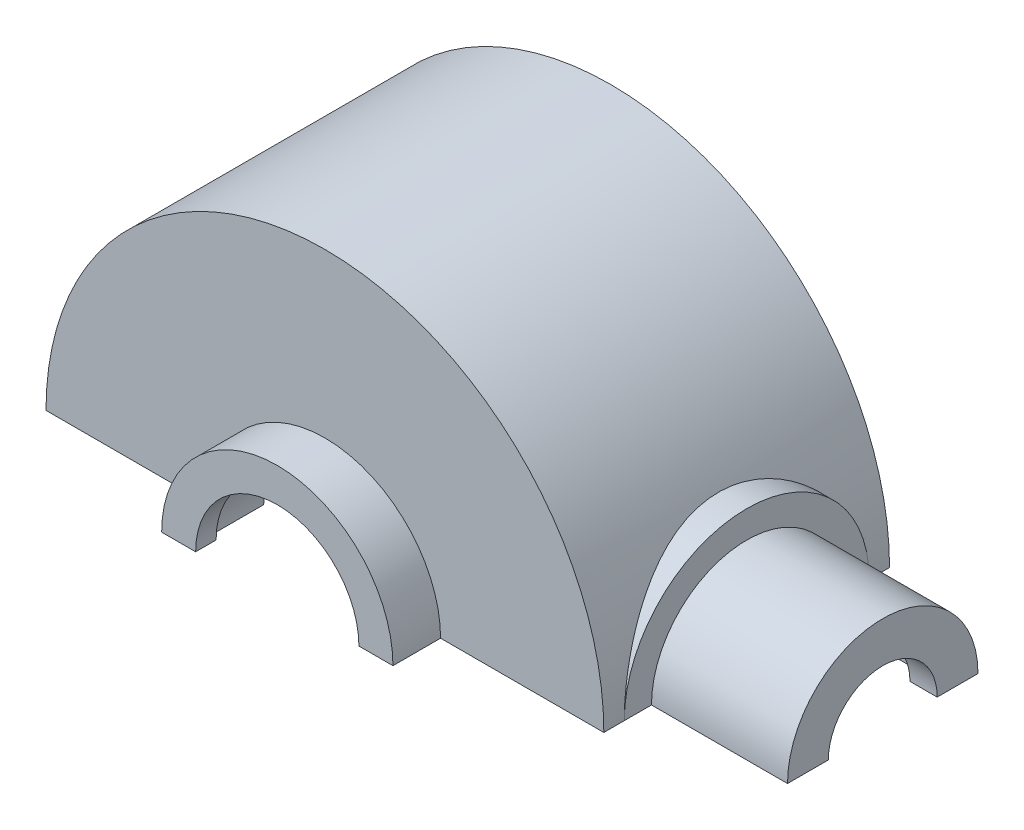
ISO-10303-21;
HEADER;
FILE_DESCRIPTION(('STEP AP214'),'2;1');
FILE_NAME('part.step','',(''),(''),'','','');
FILE_SCHEMA(('AUTOMOTIVE_DESIGN { 1 0 10303 214 1 1 1 1 }'));
ENDSEC;
DATA;
#1=APPLICATION_CONTEXT('core data for automotive mechanical design processes');
#2=APPLICATION_PROTOCOL_DEFINITION('international standard','automotive_design',2000,#1);
#3=PRODUCT_CONTEXT('',#1,'mechanical');
#4=PRODUCT('Part','Part','',(#3));
#5=PRODUCT_RELATED_PRODUCT_CATEGORY('part','',(#4));
#6=PRODUCT_DEFINITION_FORMATION('','',#4);
#7=PRODUCT_DEFINITION_CONTEXT('part definition',#1,'design');
#8=PRODUCT_DEFINITION('design','',#6,#7);
#9=PRODUCT_DEFINITION_SHAPE('','',#8);
#10=(LENGTH_UNIT() NAMED_UNIT(*) SI_UNIT(.MILLI.,.METRE.));
#11=(NAMED_UNIT(*) PLANE_ANGLE_UNIT() SI_UNIT($,.RADIAN.));
#12=(NAMED_UNIT(*) SI_UNIT($,.STERADIAN.) SOLID_ANGLE_UNIT());
#13=UNCERTAINTY_MEASURE_WITH_UNIT(LENGTH_MEASURE(1.E-05),#10,'distance_accuracy_value','');
#14=(GEOMETRIC_REPRESENTATION_CONTEXT(3) GLOBAL_UNCERTAINTY_ASSIGNED_CONTEXT((#13)) GLOBAL_UNIT_ASSIGNED_CONTEXT((#10,
#11,#12)) REPRESENTATION_CONTEXT('',''));
#15=CARTESIAN_POINT('',(0.,0.,0.));
#16=DIRECTION('',(0.,0.,1.));
#17=DIRECTION('',(1.,0.,0.));
#18=AXIS2_PLACEMENT_3D('',#15,#16,#17);
#19=CARTESIAN_POINT('',(0.,0.,0.));
#20=DIRECTION('',(0.,-1.,0.));
#21=DIRECTION('',(0.,0.,1.));
#22=AXIS2_PLACEMENT_3D('',#19,#20,#21);
#23=PLANE('',#22);
#24=DIRECTION('',(0.,0.,1.));
#25=VECTOR('',#24,1.);
#26=CARTESIAN_POINT('',(6.5,0.,-12.));
#27=LINE('',#26,#25);
#28=CARTESIAN_POINT('',(6.5,0.,-12.5));
#29=VERTEX_POINT('',#28);
#30=CARTESIAN_POINT('',(6.5,0.,-8.5));
#31=VERTEX_POINT('',#30);
#32=EDGE_CURVE('E340',#29,#31,#27,.T.);
#33=ORIENTED_EDGE('',*,*,#32,.F.);
#34=DIRECTION('',(-1.,0.,0.));
#35=VECTOR('',#34,1.);
#36=CARTESIAN_POINT('',(0.,0.,-12.5));
#37=LINE('',#36,#35);
#38=CARTESIAN_POINT('',(6.,0.,-12.5));
#39=VERTEX_POINT('',#38);
#40=EDGE_CURVE('E240',#29,#39,#37,.T.);
#41=ORIENTED_EDGE('',*,*,#40,.T.);
#42=DIRECTION('',(0.,0.,1.));
#43=VECTOR('',#42,1.);
#44=CARTESIAN_POINT('',(6.,0.,-14.));
#45=LINE('',#44,#43);
#46=CARTESIAN_POINT('',(6.,0.,-14.));
#47=VERTEX_POINT('',#46);
#48=EDGE_CURVE('E423',#47,#39,#45,.T.);
#49=ORIENTED_EDGE('',*,*,#48,.F.);
#50=DIRECTION('',(1.,0.,0.));
#51=VECTOR('',#50,1.);
#52=CARTESIAN_POINT('',(0.,0.,-14.));
#53=LINE('',#52,#51);
#54=CARTESIAN_POINT('',(8.5,0.,-14.));
#55=VERTEX_POINT('',#54);
#56=EDGE_CURVE('E382',#47,#55,#53,.T.);
#57=ORIENTED_EDGE('',*,*,#56,.T.);
#58=DIRECTION('',(0.,0.,1.));
#59=VECTOR('',#58,1.);
#60=CARTESIAN_POINT('',(8.5,0.,-14.));
#61=LINE('',#60,#59);
#62=CARTESIAN_POINT('',(8.5,0.,-10.5));
#63=VERTEX_POINT('',#62);
#64=EDGE_CURVE('E386',#55,#63,#61,.T.);
#65=ORIENTED_EDGE('',*,*,#64,.T.);
#66=DIRECTION('',(1.,0.,0.));
#67=VECTOR('',#66,1.);
#68=CARTESIAN_POINT('',(8.5,0.,-10.5));
#69=LINE('',#68,#67);
#70=CARTESIAN_POINT('',(20.5,-1.43150734892568E-13,-10.5));
#71=VERTEX_POINT('',#70);
#72=EDGE_CURVE('E389',#63,#71,#69,.T.);
#73=ORIENTED_EDGE('',*,*,#72,.T.);
#74=DIRECTION('',(0.,0.,1.));
#75=VECTOR('',#74,1.);
#76=CARTESIAN_POINT('',(20.5,-1.43150734892568E-13,-10.5));
#77=LINE('',#76,#75);
#78=CARTESIAN_POINT('',(20.5,0.,-9.));
#79=VERTEX_POINT('',#78);
#80=EDGE_CURVE('E393',#71,#79,#77,.T.);
#81=ORIENTED_EDGE('',*,*,#80,.T.);
#82=DIRECTION('',(0.,0.,-1.));
#83=VECTOR('',#82,1.);
#84=CARTESIAN_POINT('',(20.5,0.,0.));
#85=LINE('',#84,#83);
#86=CARTESIAN_POINT('',(20.5,0.,-7.));
#87=VERTEX_POINT('',#86);
#88=EDGE_CURVE('E446',#87,#79,#85,.T.);
#89=ORIENTED_EDGE('',*,*,#88,.F.);
#90=DIRECTION('',(-1.,0.,0.));
#91=VECTOR('',#90,1.);
#92=CARTESIAN_POINT('',(30.5,0.,-7.));
#93=LINE('',#92,#91);
#94=CARTESIAN_POINT('',(30.5,0.,-7.));
#95=VERTEX_POINT('',#94);
#96=EDGE_CURVE('E507',#95,#87,#93,.T.);
#97=ORIENTED_EDGE('',*,*,#96,.F.);
#98=DIRECTION('',(0.,0.,-1.));
#99=VECTOR('',#98,1.);
#100=CARTESIAN_POINT('',(30.5,0.,7.));
#101=LINE('',#100,#99);
#102=CARTESIAN_POINT('',(30.5,0.,-4.));
#103=VERTEX_POINT('',#102);
#104=EDGE_CURVE('E503',#103,#95,#101,.T.);
#105=ORIENTED_EDGE('',*,*,#104,.F.);
#106=DIRECTION('',(-1.,0.,0.));
#107=VECTOR('',#106,1.);
#108=CARTESIAN_POINT('',(30.5,-2.12980361669431E-13,-4.));
#109=LINE('',#108,#107);
#110=CARTESIAN_POINT('',(28.5,0.,-4.));
#111=VERTEX_POINT('',#110);
#112=EDGE_CURVE('E270',#103,#111,#109,.T.);
#113=ORIENTED_EDGE('',*,*,#112,.T.);
#114=DIRECTION('',(0.,0.,-1.));
#115=VECTOR('',#114,1.);
#116=CARTESIAN_POINT('',(28.5,0.,0.));
#117=LINE('',#116,#115);
#118=CARTESIAN_POINT('',(28.5,-1.99014436314059E-13,-5.));
#119=VERTEX_POINT('',#118);
#120=EDGE_CURVE('E550',#111,#119,#117,.T.);
#121=ORIENTED_EDGE('',*,*,#120,.T.);
#122=DIRECTION('',(-1.,0.,0.));
#123=VECTOR('',#122,1.);
#124=CARTESIAN_POINT('',(28.5,-1.99014436314059E-13,-5.));
#125=LINE('',#124,#123);
#126=CARTESIAN_POINT('',(24.5,-1.99014436314059E-13,-5.));
#127=VERTEX_POINT('',#126);
#128=EDGE_CURVE('E486',#119,#127,#125,.T.);
#129=ORIENTED_EDGE('',*,*,#128,.T.);
#130=DIRECTION('',(0.,0.,-1.));
#131=VECTOR('',#130,1.);
#132=CARTESIAN_POINT('',(24.5,-1.99014436314059E-13,5.));
#133=LINE('',#132,#131);
#134=CARTESIAN_POINT('',(24.5,-1.99014436314059E-13,-2.5));
#135=VERTEX_POINT('',#134);
#136=EDGE_CURVE('E266',#135,#127,#133,.T.);
#137=ORIENTED_EDGE('',*,*,#136,.F.);
#138=DIRECTION('',(1.,0.,0.));
#139=VECTOR('',#138,1.);
#140=CARTESIAN_POINT('',(23.5,-1.64099622925627E-13,-2.5));
#141=LINE('',#140,#139);
#142=CARTESIAN_POINT('',(23.5,-1.99014436314059E-13,-2.5));
#143=VERTEX_POINT('',#142);
#144=EDGE_CURVE('E253',#143,#135,#141,.T.);
#145=ORIENTED_EDGE('',*,*,#144,.F.);
#146=DIRECTION('',(0.,0.,-1.));
#147=VECTOR('',#146,1.);
#148=CARTESIAN_POINT('',(23.5,-1.99014436314059E-13,5.));
#149=LINE('',#148,#147);
#150=CARTESIAN_POINT('',(23.5,-1.99014436314059E-13,-5.));
#151=VERTEX_POINT('',#150);
#152=EDGE_CURVE('E258',#143,#151,#149,.T.);
#153=ORIENTED_EDGE('',*,*,#152,.T.);
#154=CARTESIAN_POINT('',(18.5,-1.29184809537196E-13,-5.));
#155=VERTEX_POINT('',#154);
#156=EDGE_CURVE('E481',#151,#155,#125,.T.);
#157=ORIENTED_EDGE('',*,*,#156,.T.);
#158=DIRECTION('',(0.,0.,1.));
#159=VECTOR('',#158,1.);
#160=CARTESIAN_POINT('',(18.5,-1.29184809537196E-13,-8.5));
#161=LINE('',#160,#159);
#162=CARTESIAN_POINT('',(18.5,-1.29184809537196E-13,-8.5));
#163=VERTEX_POINT('',#162);
#164=EDGE_CURVE('E361',#163,#155,#161,.T.);
#165=ORIENTED_EDGE('',*,*,#164,.F.);
#166=DIRECTION('',(1.,0.,0.));
#167=VECTOR('',#166,1.);
#168=CARTESIAN_POINT('',(8.5,0.,-8.5));
#169=LINE('',#168,#167);
#170=EDGE_CURVE('E343',#31,#163,#169,.T.);
#171=ORIENTED_EDGE('',*,*,#170,.F.);
#172=EDGE_LOOP('',(#33,#41,#49,#57,#65,#73,#81,#89,#97,#105,#113,#121,#129,#137,#145,#153,#157,
#165,#171));
#173=FACE_BOUND('',#172,.T.);
#174=ADVANCED_FACE('F39',(#173),#23,.T.);
#175=DIRECTION('',(-1.,0.,0.));
#176=VECTOR('',#175,1.);
#177=CARTESIAN_POINT('',(0.,0.,12.5));
#178=LINE('',#177,#176);
#179=CARTESIAN_POINT('',(6.5,0.,12.5));
#180=VERTEX_POINT('',#179);
#181=CARTESIAN_POINT('',(6.,0.,12.5));
#182=VERTEX_POINT('',#181);
#183=EDGE_CURVE('E61',#180,#182,#178,.T.);
#184=ORIENTED_EDGE('',*,*,#183,.F.);
#185=DIRECTION('',(0.,0.,1.));
#186=VECTOR('',#185,1.);
#187=CARTESIAN_POINT('',(6.5,0.,8.5));
#188=LINE('',#187,#186);
#189=CARTESIAN_POINT('',(6.5,0.,8.5));
#190=VERTEX_POINT('',#189);
#191=EDGE_CURVE('E220',#190,#180,#188,.T.);
#192=ORIENTED_EDGE('',*,*,#191,.F.);
#193=DIRECTION('',(-1.,0.,0.));
#194=VECTOR('',#193,1.);
#195=CARTESIAN_POINT('',(20.5,-1.43150734892568E-13,8.5));
#196=LINE('',#195,#194);
#197=CARTESIAN_POINT('',(18.5,-1.29184809537196E-13,8.5));
#198=VERTEX_POINT('',#197);
#199=EDGE_CURVE('E227',#198,#190,#196,.T.);
#200=ORIENTED_EDGE('',*,*,#199,.F.);
#201=CARTESIAN_POINT('',(18.5,-1.29184809537196E-13,5.));
#202=VERTEX_POINT('',#201);
#203=EDGE_CURVE('E360',#202,#198,#161,.T.);
#204=ORIENTED_EDGE('',*,*,#203,.F.);
#205=DIRECTION('',(-1.,0.,0.));
#206=VECTOR('',#205,1.);
#207=CARTESIAN_POINT('',(28.5,-1.99014436314059E-13,5.));
#208=LINE('',#207,#206);
#209=CARTESIAN_POINT('',(23.5,-1.99014436314059E-13,5.));
#210=VERTEX_POINT('',#209);
#211=EDGE_CURVE('E493',#210,#202,#208,.T.);
#212=ORIENTED_EDGE('',*,*,#211,.F.);
#213=CARTESIAN_POINT('',(23.5,-1.99014436314059E-13,2.5));
#214=VERTEX_POINT('',#213);
#215=EDGE_CURVE('E260',#210,#214,#149,.T.);
#216=ORIENTED_EDGE('',*,*,#215,.T.);
#217=DIRECTION('',(1.,0.,0.));
#218=VECTOR('',#217,1.);
#219=CARTESIAN_POINT('',(23.5,-1.64099622925627E-13,2.5));
#220=LINE('',#219,#218);
#221=CARTESIAN_POINT('',(24.5,-1.99014436314059E-13,2.5));
#222=VERTEX_POINT('',#221);
#223=EDGE_CURVE('E250',#222,#214,#220,.F.);
#224=ORIENTED_EDGE('',*,*,#223,.F.);
#225=CARTESIAN_POINT('',(24.5,-1.99014436314059E-13,5.));
#226=VERTEX_POINT('',#225);
#227=EDGE_CURVE('E259',#226,#222,#133,.T.);
#228=ORIENTED_EDGE('',*,*,#227,.F.);
#229=CARTESIAN_POINT('',(28.5,-1.99014436314059E-13,5.));
#230=VERTEX_POINT('',#229);
#231=EDGE_CURVE('E494',#230,#226,#208,.T.);
#232=ORIENTED_EDGE('',*,*,#231,.F.);
#233=CARTESIAN_POINT('',(28.5,0.,4.));
#234=VERTEX_POINT('',#233);
#235=EDGE_CURVE('E487',#230,#234,#117,.T.);
#236=ORIENTED_EDGE('',*,*,#235,.T.);
#237=DIRECTION('',(-1.,0.,0.));
#238=VECTOR('',#237,1.);
#239=CARTESIAN_POINT('',(30.5,-2.12980361669431E-13,4.));
#240=LINE('',#239,#238);
#241=CARTESIAN_POINT('',(30.5,0.,4.));
#242=VERTEX_POINT('',#241);
#243=EDGE_CURVE('E273',#234,#242,#240,.F.);
#244=ORIENTED_EDGE('',*,*,#243,.T.);
#245=CARTESIAN_POINT('',(30.5,0.,7.));
#246=VERTEX_POINT('',#245);
#247=EDGE_CURVE('E504',#246,#242,#101,.T.);
#248=ORIENTED_EDGE('',*,*,#247,.F.);
#249=DIRECTION('',(-1.,0.,0.));
#250=VECTOR('',#249,1.);
#251=CARTESIAN_POINT('',(30.5,0.,7.));
#252=LINE('',#251,#250);
#253=CARTESIAN_POINT('',(20.5,0.,7.));
#254=VERTEX_POINT('',#253);
#255=EDGE_CURVE('E447',#246,#254,#252,.T.);
#256=ORIENTED_EDGE('',*,*,#255,.T.);
#257=CARTESIAN_POINT('',(20.5,-1.43150734892568E-13,9.));
#258=VERTEX_POINT('',#257);
#259=EDGE_CURVE('E448',#258,#254,#85,.T.);
#260=ORIENTED_EDGE('',*,*,#259,.F.);
#261=CARTESIAN_POINT('',(20.5,-1.43150734892568E-13,10.5));
#262=VERTEX_POINT('',#261);
#263=EDGE_CURVE('E392',#258,#262,#77,.T.);
#264=ORIENTED_EDGE('',*,*,#263,.T.);
#265=DIRECTION('',(-1.,0.,0.));
#266=VECTOR('',#265,1.);
#267=CARTESIAN_POINT('',(20.5,-1.43150734892568E-13,10.5));
#268=LINE('',#267,#266);
#269=CARTESIAN_POINT('',(8.5,0.,10.5));
#270=VERTEX_POINT('',#269);
#271=EDGE_CURVE('E396',#262,#270,#268,.T.);
#272=ORIENTED_EDGE('',*,*,#271,.T.);
#273=DIRECTION('',(0.,0.,1.));
#274=VECTOR('',#273,1.);
#275=CARTESIAN_POINT('',(8.5,0.,10.5));
#276=LINE('',#275,#274);
#277=CARTESIAN_POINT('',(8.5,0.,14.));
#278=VERTEX_POINT('',#277);
#279=EDGE_CURVE('E399',#270,#278,#276,.T.);
#280=ORIENTED_EDGE('',*,*,#279,.T.);
#281=DIRECTION('',(-1.,0.,0.));
#282=VECTOR('',#281,1.);
#283=CARTESIAN_POINT('',(8.5,0.,14.));
#284=LINE('',#283,#282);
#285=CARTESIAN_POINT('',(6.,0.,14.));
#286=VERTEX_POINT('',#285);
#287=EDGE_CURVE('E380',#278,#286,#284,.T.);
#288=ORIENTED_EDGE('',*,*,#287,.T.);
#289=EDGE_CURVE('E238',#182,#286,#45,.T.);
#290=ORIENTED_EDGE('',*,*,#289,.F.);
#291=EDGE_LOOP('',(#184,#192,#200,#204,#212,#216,#224,#228,#232,#236,#244,#248,#256,#260,#264,
#272,#280,#288,#290));
#292=FACE_BOUND('',#291,.T.);
#293=ADVANCED_FACE('F236',(#292),#23,.T.);
#294=DIRECTION('',(0.,0.,1.));
#295=VECTOR('',#294,1.);
#296=CARTESIAN_POINT('',(-6.5,0.,8.5));
#297=LINE('',#296,#295);
#298=CARTESIAN_POINT('',(-6.5,0.,8.5));
#299=VERTEX_POINT('',#298);
#300=CARTESIAN_POINT('',(-6.5,0.,12.5));
#301=VERTEX_POINT('',#300);
#302=EDGE_CURVE('E334',#299,#301,#297,.T.);
#303=ORIENTED_EDGE('',*,*,#302,.T.);
#304=DIRECTION('',(-1.,0.,0.));
#305=VECTOR('',#304,1.);
#306=CARTESIAN_POINT('',(0.,0.,12.5));
#307=LINE('',#306,#305);
#308=CARTESIAN_POINT('',(-6.,0.,12.5));
#309=VERTEX_POINT('',#308);
#310=EDGE_CURVE('E232',#309,#301,#307,.T.);
#311=ORIENTED_EDGE('',*,*,#310,.F.);
#312=DIRECTION('',(0.,0.,1.));
#313=VECTOR('',#312,1.);
#314=CARTESIAN_POINT('',(-6.,0.,-14.));
#315=LINE('',#314,#313);
#316=CARTESIAN_POINT('',(-6.,0.,14.));
#317=VERTEX_POINT('',#316);
#318=EDGE_CURVE('E420',#317,#309,#315,.F.);
#319=ORIENTED_EDGE('',*,*,#318,.F.);
#320=CARTESIAN_POINT('',(-8.5,0.,14.));
#321=VERTEX_POINT('',#320);
#322=EDGE_CURVE('E379',#317,#321,#284,.T.);
#323=ORIENTED_EDGE('',*,*,#322,.T.);
#324=DIRECTION('',(0.,0.,1.));
#325=VECTOR('',#324,1.);
#326=CARTESIAN_POINT('',(-8.5,0.,10.5));
#327=LINE('',#326,#325);
#328=CARTESIAN_POINT('',(-8.5,0.,10.5));
#329=VERTEX_POINT('',#328);
#330=EDGE_CURVE('E376',#329,#321,#327,.T.);
#331=ORIENTED_EDGE('',*,*,#330,.F.);
#332=DIRECTION('',(1.,0.,0.));
#333=VECTOR('',#332,1.);
#334=CARTESIAN_POINT('',(-20.5,0.,10.5));
#335=LINE('',#334,#333);
#336=CARTESIAN_POINT('',(-20.5,0.,10.5));
#337=VERTEX_POINT('',#336);
#338=EDGE_CURVE('E373',#337,#329,#335,.T.);
#339=ORIENTED_EDGE('',*,*,#338,.F.);
#340=DIRECTION('',(0.,0.,1.));
#341=VECTOR('',#340,1.);
#342=CARTESIAN_POINT('',(-20.5,0.,-10.5));
#343=LINE('',#342,#341);
#344=CARTESIAN_POINT('',(-20.5,0.,-10.5));
#345=VERTEX_POINT('',#344);
#346=EDGE_CURVE('E371',#345,#337,#343,.T.);
#347=ORIENTED_EDGE('',*,*,#346,.F.);
#348=DIRECTION('',(-1.,0.,0.));
#349=VECTOR('',#348,1.);
#350=CARTESIAN_POINT('',(-8.5,0.,-10.5));
#351=LINE('',#350,#349);
#352=CARTESIAN_POINT('',(-8.5,0.,-10.5));
#353=VERTEX_POINT('',#352);
#354=EDGE_CURVE('E368',#353,#345,#351,.T.);
#355=ORIENTED_EDGE('',*,*,#354,.F.);
#356=DIRECTION('',(0.,0.,1.));
#357=VECTOR('',#356,1.);
#358=CARTESIAN_POINT('',(-8.5,0.,-14.));
#359=LINE('',#358,#357);
#360=CARTESIAN_POINT('',(-8.5,0.,-14.));
#361=VERTEX_POINT('',#360);
#362=EDGE_CURVE('E365',#361,#353,#359,.T.);
#363=ORIENTED_EDGE('',*,*,#362,.F.);
#364=CARTESIAN_POINT('',(-6.,0.,-14.));
#365=VERTEX_POINT('',#364);
#366=EDGE_CURVE('E383',#361,#365,#53,.T.);
#367=ORIENTED_EDGE('',*,*,#366,.T.);
#368=CARTESIAN_POINT('',(-6.,0.,-12.5));
#369=VERTEX_POINT('',#368);
#370=EDGE_CURVE('E425',#369,#365,#315,.F.);
#371=ORIENTED_EDGE('',*,*,#370,.F.);
#372=DIRECTION('',(-1.,0.,0.));
#373=VECTOR('',#372,1.);
#374=CARTESIAN_POINT('',(0.,0.,-12.5));
#375=LINE('',#374,#373);
#376=CARTESIAN_POINT('',(-6.5,0.,-12.5));
#377=VERTEX_POINT('',#376);
#378=EDGE_CURVE('E53',#369,#377,#375,.T.);
#379=ORIENTED_EDGE('',*,*,#378,.T.);
#380=DIRECTION('',(0.,0.,1.));
#381=VECTOR('',#380,1.);
#382=CARTESIAN_POINT('',(-6.5,0.,-12.));
#383=LINE('',#382,#381);
#384=CARTESIAN_POINT('',(-6.5,0.,-8.5));
#385=VERTEX_POINT('',#384);
#386=EDGE_CURVE('E355',#377,#385,#383,.T.);
#387=ORIENTED_EDGE('',*,*,#386,.T.);
#388=DIRECTION('',(-1.,0.,0.));
#389=VECTOR('',#388,1.);
#390=CARTESIAN_POINT('',(0.,0.,-8.5));
#391=LINE('',#390,#389);
#392=CARTESIAN_POINT('',(-18.5,1.29184809537196E-13,-8.5));
#393=VERTEX_POINT('',#392);
#394=EDGE_CURVE('E352',#385,#393,#391,.T.);
#395=ORIENTED_EDGE('',*,*,#394,.T.);
#396=DIRECTION('',(0.,0.,1.));
#397=VECTOR('',#396,1.);
#398=CARTESIAN_POINT('',(-18.5,1.29184809537196E-13,-8.5));
#399=LINE('',#398,#397);
#400=CARTESIAN_POINT('',(-18.5,1.29184809537196E-13,8.5));
#401=VERTEX_POINT('',#400);
#402=EDGE_CURVE('E345',#393,#401,#399,.T.);
#403=ORIENTED_EDGE('',*,*,#402,.T.);
#404=DIRECTION('',(1.,0.,0.));
#405=VECTOR('',#404,1.);
#406=CARTESIAN_POINT('',(0.,0.,8.5));
#407=LINE('',#406,#405);
#408=EDGE_CURVE('E339',#401,#299,#407,.T.);
#409=ORIENTED_EDGE('',*,*,#408,.T.);
#410=EDGE_LOOP('',(#303,#311,#319,#323,#331,#339,#347,#355,#363,#367,#371,#379,#387,#395,#403,#409));
#411=FACE_BOUND('',#410,.T.);
#412=ADVANCED_FACE('F317',(#411),#23,.T.);
#413=CARTESIAN_POINT('',(0.,0.,-14.));
#414=DIRECTION('',(0.,0.,1.));
#415=DIRECTION('',(1.,0.,0.));
#416=AXIS2_PLACEMENT_3D('',#413,#414,#415);
#417=CYLINDRICAL_SURFACE('',#416,6.);
#418=CARTESIAN_POINT('',(0.,0.,-12.5));
#419=DIRECTION('',(0.,0.,1.));
#420=DIRECTION('',(1.,0.,0.));
#421=AXIS2_PLACEMENT_3D('',#418,#419,#420);
#422=CIRCLE('',#421,6.);
#423=EDGE_CURVE('E11',#369,#39,#422,.F.);
#424=ORIENTED_EDGE('',*,*,#423,.F.);
#425=ORIENTED_EDGE('',*,*,#370,.T.);
#426=CARTESIAN_POINT('',(0.,0.,-14.));
#427=DIRECTION('',(0.,0.,1.));
#428=DIRECTION('',(1.,0.,0.));
#429=AXIS2_PLACEMENT_3D('',#426,#427,#428);
#430=CIRCLE('',#429,6.);
#431=EDGE_CURVE('E429',#47,#365,#430,.T.);
#432=ORIENTED_EDGE('',*,*,#431,.F.);
#433=ORIENTED_EDGE('',*,*,#48,.T.);
#434=EDGE_LOOP('',(#424,#425,#432,#433));
#435=FACE_BOUND('',#434,.T.);
#436=ADVANCED_FACE('F324',(#435),#417,.F.);
#437=CARTESIAN_POINT('',(30.5,0.,0.));
#438=DIRECTION('',(-1.,0.,0.));
#439=DIRECTION('',(0.,0.,1.));
#440=AXIS2_PLACEMENT_3D('',#437,#438,#439);
#441=CYLINDRICAL_SURFACE('',#440,5.);
#442=ORIENTED_EDGE('',*,*,#156,.F.);
#443=CARTESIAN_POINT('',(23.5,0.,0.));
#444=DIRECTION('',(1.,0.,0.));
#445=DIRECTION('',(0.,0.,-1.));
#446=AXIS2_PLACEMENT_3D('',#443,#444,#445);
#447=CIRCLE('',#446,5.);
#448=EDGE_CURVE('E256',#151,#210,#447,.T.);
#449=ORIENTED_EDGE('',*,*,#448,.T.);
#450=ORIENTED_EDGE('',*,*,#211,.T.);
#451=CARTESIAN_POINT('',(18.5,-1.31450406115619E-13,5.));
#452=CARTESIAN_POINT('',(18.5000151246052,0.137964750262103,5.00001760728971));
#453=CARTESIAN_POINT('',(18.4984572047808,0.27592362965478,4.99429046009086));
#454=CARTESIAN_POINT('',(18.4923053619449,0.550807756373042,4.97147670717961));
#455=CARTESIAN_POINT('',(18.4877119619069,0.68773317764061,4.95439205821294));
#456=CARTESIAN_POINT('',(18.4756117969188,0.959293419038475,4.90904058061211));
#457=CARTESIAN_POINT('',(18.468111124062,1.09393241851227,4.88079713249321));
#458=CARTESIAN_POINT('',(18.4504065037614,1.36025913155794,4.81337347852813));
#459=CARTESIAN_POINT('',(18.4402025181069,1.4919468033849,4.77419311809062));
#460=CARTESIAN_POINT('',(18.4173682422412,1.75142762020294,4.68522136460615));
#461=CARTESIAN_POINT('',(18.4047387691769,1.87922206007164,4.63543354459752));
#462=CARTESIAN_POINT('',(18.3773919273703,2.13012470095992,4.52563290922129));
#463=CARTESIAN_POINT('',(18.3626737846763,2.25323114330922,4.46561630193604));
#464=CARTESIAN_POINT('',(18.3159574909505,2.61426364133215,4.27086051008515));
#465=CARTESIAN_POINT('',(18.281379153707,2.84410097109861,4.1213470802041));
#466=CARTESIAN_POINT('',(18.2082023427518,3.28047834476077,3.78368716040657));
#467=CARTESIAN_POINT('',(18.1695341350003,3.4864205664228,3.5947882394685));
#468=CARTESIAN_POINT('',(18.0929643617028,3.86417143699407,3.1852410515293));
#469=CARTESIAN_POINT('',(18.0550629510318,4.03597325095879,2.96458644222207));
#470=CARTESIAN_POINT('',(17.9836020780406,4.34344403507113,2.49301285533583));
#471=CARTESIAN_POINT('',(17.9501313236113,4.47841976919158,2.24162740130843));
#472=CARTESIAN_POINT('',(17.8923591200852,4.70394804900517,1.71869092849253));
#473=CARTESIAN_POINT('',(17.8680554755898,4.79451123246312,1.4471447565904));
#474=CARTESIAN_POINT('',(17.8320946132667,4.92656298557415,0.898225108885923));
#475=CARTESIAN_POINT('',(17.8201577235982,4.96913883253098,0.621131954177199));
#476=CARTESIAN_POINT('',(17.8094466765718,5.00739815563692,0.0634918364960449));
#477=CARTESIAN_POINT('',(17.8106702791021,5.00308961220642,-0.217054530568061));
#478=CARTESIAN_POINT('',(17.8258919705629,4.94856527361425,-0.765099825214815));
#479=CARTESIAN_POINT('',(17.839522359875,4.89967079541346,-1.0327421158426));
#480=CARTESIAN_POINT('',(17.8774338550611,4.75947196552946,-1.55587935592282));
#481=CARTESIAN_POINT('',(17.9017157293038,4.66816455426678,-1.81137342756238));
#482=CARTESIAN_POINT('',(17.9585087621133,4.44469998257774,-2.30635786542067));
#483=CARTESIAN_POINT('',(17.9911117586977,4.31208304144339,-2.54562922231502));
#484=CARTESIAN_POINT('',(18.0608465714254,4.00995400258255,-2.99907089685834));
#485=CARTESIAN_POINT('',(18.0979792120819,3.84043518333494,-3.21323663067615));
#486=CARTESIAN_POINT('',(18.1547222629766,3.55888564047918,-3.51485148256527));
#487=CARTESIAN_POINT('',(18.17413814468,3.45860682878359,-3.6135634943991));
#488=CARTESIAN_POINT('',(18.2125870888532,3.25006120518794,-3.80221517206881));
#489=CARTESIAN_POINT('',(18.2316202828889,3.14179720044674,-3.89215789513412));
#490=CARTESIAN_POINT('',(18.2687904395726,2.91790717391559,-4.06271375150743));
#491=CARTESIAN_POINT('',(18.286926818654,2.80227646765568,-4.14332085464636));
#492=CARTESIAN_POINT('',(18.3217820514212,2.56451352932891,-4.29454410836308));
#493=CARTESIAN_POINT('',(18.3385014566833,2.44238385749033,-4.36516415376372));
#494=CARTESIAN_POINT('',(18.3701511533085,2.19170979874241,-4.49627910303398));
#495=CARTESIAN_POINT('',(18.3850710637011,2.06313373520303,-4.55671598852935));
#496=CARTESIAN_POINT('',(18.4125834028254,1.80114184600685,-4.66648162600379));
#497=CARTESIAN_POINT('',(18.4251767659605,1.66772798920386,-4.7158148392589));
#498=CARTESIAN_POINT('',(18.447669024586,1.39711186463488,-4.80294330927931));
#499=CARTESIAN_POINT('',(18.4575706223652,1.25991354971703,-4.84075014215563));
#500=CARTESIAN_POINT('',(18.4744046466693,0.982674850336608,-4.90454601927816));
#501=CARTESIAN_POINT('',(18.4813384392906,0.842635804636814,-4.93054050115304));
#502=CARTESIAN_POINT('',(18.4910987867489,0.585475549767134,-4.96699059770188));
#503=CARTESIAN_POINT('',(18.4944324112508,0.468642553361762,-4.97937192631406));
#504=CARTESIAN_POINT('',(18.4988849623739,0.234542699770909,-4.99587395887267));
#505=CARTESIAN_POINT('',(18.500007455284,0.117276847352032,-5.00000796489476));
#506=CARTESIAN_POINT('',(18.5,-1.31315371643953E-13,-5.));
#507=B_SPLINE_CURVE_WITH_KNOTS('',3,(#451,#452,#453,#454,#455,#456,#457,#458,#459,#460,#461,
#462,#463,#464,#465,#466,#467,#468,#469,#470,#471,#472,#473,#474,#475,#476,#477,#478,#479,#480,
#481,#482,#483,#484,#485,#486,#487,#488,#489,#490,#491,#492,#493,#494,#495,#496,#497,#498,#499,
#500,#501,#502,#503,#504,#505,#506),.UNSPECIFIED.,.F.,.F.,(4,2,2,2,2,2,2,2,2,2,2,2,2,2,2,2,2,2,
2,2,2,2,2,2,2,2,2,4),(0.,0.413757565737634,0.827443865046259,1.24026794457112,1.65309785958692,
2.06578893536703,2.47863333411304,3.30369879966735,4.14627117444718,4.98901206351199,
5.8466666894152,6.70411578806166,7.54172000578556,8.37918165304719,9.19260397898145,
10.0060849926003,10.8289647932705,11.6519946036191,12.0777196211084,12.5032956837303,
12.9291451239449,13.354828027702,13.7828597553011,14.2107191984479,14.6381475097727,
15.0653788614268,15.4176790892699,15.7694106325157),.UNSPECIFIED.);
#508=EDGE_CURVE('E276',#202,#155,#507,.T.);
#509=ORIENTED_EDGE('',*,*,#508,.T.);
#510=EDGE_LOOP('',(#442,#449,#450,#509));
#511=FACE_BOUND('',#510,.T.);
#512=ADVANCED_FACE('F329',(#511),#441,.F.);
#513=CARTESIAN_POINT('',(0.,0.,0.));
#514=DIRECTION('',(0.,0.,1.));
#515=DIRECTION('',(1.,0.,0.));
#516=AXIS2_PLACEMENT_3D('',#513,#514,#515);
#517=CYLINDRICAL_SURFACE('',#516,18.5);
#518=ORIENTED_EDGE('',*,*,#164,.T.);
#519=ORIENTED_EDGE('',*,*,#508,.F.);
#520=ORIENTED_EDGE('',*,*,#203,.T.);
#521=CARTESIAN_POINT('',(0.,0.,8.5));
#522=DIRECTION('',(0.,0.,-1.));
#523=DIRECTION('',(-1.,0.,0.));
#524=AXIS2_PLACEMENT_3D('',#521,#522,#523);
#525=CIRCLE('',#524,18.5);
#526=EDGE_CURVE('E589',#198,#401,#525,.F.);
#527=ORIENTED_EDGE('',*,*,#526,.T.);
#528=ORIENTED_EDGE('',*,*,#402,.F.);
#529=CARTESIAN_POINT('',(0.,0.,-8.5));
#530=DIRECTION('',(0.,0.,1.));
#531=DIRECTION('',(1.,0.,0.));
#532=AXIS2_PLACEMENT_3D('',#529,#530,#531);
#533=CIRCLE('',#532,18.5);
#534=EDGE_CURVE('E588',#163,#393,#533,.T.);
#535=ORIENTED_EDGE('',*,*,#534,.F.);
#536=EDGE_LOOP('',(#518,#519,#520,#527,#528,#535));
#537=FACE_BOUND('',#536,.T.);
#538=ADVANCED_FACE('F472',(#537),#517,.F.);
#539=CARTESIAN_POINT('',(20.5,0.,0.));
#540=DIRECTION('',(1.,0.,0.));
#541=DIRECTION('',(0.,0.,-1.));
#542=AXIS2_PLACEMENT_3D('',#539,#540,#541);
#543=PLANE('',#542);
#544=ORIENTED_EDGE('',*,*,#259,.T.);
#545=CARTESIAN_POINT('',(20.5,0.,0.));
#546=DIRECTION('',(1.,0.,0.));
#547=DIRECTION('',(0.,0.,-1.));
#548=AXIS2_PLACEMENT_3D('',#545,#546,#547);
#549=CIRCLE('',#548,7.);
#550=EDGE_CURVE('E496',#87,#254,#549,.T.);
#551=ORIENTED_EDGE('',*,*,#550,.F.);
#552=ORIENTED_EDGE('',*,*,#88,.T.);
#553=CARTESIAN_POINT('',(20.5,0.,0.));
#554=DIRECTION('',(1.,0.,0.));
#555=DIRECTION('',(0.,0.,-1.));
#556=AXIS2_PLACEMENT_3D('',#553,#554,#555);
#557=CIRCLE('',#556,9.);
#558=EDGE_CURVE('E434',#79,#258,#557,.T.);
#559=ORIENTED_EDGE('',*,*,#558,.T.);
#560=EDGE_LOOP('',(#544,#551,#552,#559));
#561=FACE_BOUND('',#560,.T.);
#562=ADVANCED_FACE('F477',(#561),#543,.T.);
#563=CARTESIAN_POINT('',(8.5,0.,14.));
#564=DIRECTION('',(0.,0.,-1.));
#565=DIRECTION('',(-1.,0.,0.));
#566=AXIS2_PLACEMENT_3D('',#563,#564,#565);
#567=PLANE('',#566);
#568=ORIENTED_EDGE('',*,*,#322,.F.);
#569=CARTESIAN_POINT('',(0.,0.,14.));
#570=DIRECTION('',(0.,0.,1.));
#571=DIRECTION('',(1.,0.,0.));
#572=AXIS2_PLACEMENT_3D('',#569,#570,#571);
#573=CIRCLE('',#572,6.);
#574=EDGE_CURVE('E421',#286,#317,#573,.T.);
#575=ORIENTED_EDGE('',*,*,#574,.F.);
#576=ORIENTED_EDGE('',*,*,#287,.F.);
#577=CARTESIAN_POINT('',(0.,0.,14.));
#578=DIRECTION('',(0.,0.,1.));
#579=DIRECTION('',(1.,0.,0.));
#580=AXIS2_PLACEMENT_3D('',#577,#578,#579);
#581=CIRCLE('',#580,8.5);
#582=EDGE_CURVE('E402',#278,#321,#581,.T.);
#583=ORIENTED_EDGE('',*,*,#582,.T.);
#584=EDGE_LOOP('',(#568,#575,#576,#583));
#585=FACE_BOUND('',#584,.T.);
#586=ADVANCED_FACE('F556',(#585),#567,.F.);
#587=CARTESIAN_POINT('',(0.,0.,-14.));
#588=DIRECTION('',(0.,0.,1.));
#589=DIRECTION('',(1.,0.,0.));
#590=AXIS2_PLACEMENT_3D('',#587,#588,#589);
#591=PLANE('',#590);
#592=ORIENTED_EDGE('',*,*,#56,.F.);
#593=ORIENTED_EDGE('',*,*,#431,.T.);
#594=ORIENTED_EDGE('',*,*,#366,.F.);
#595=CARTESIAN_POINT('',(0.,0.,-14.));
#596=DIRECTION('',(0.,0.,1.));
#597=DIRECTION('',(1.,0.,0.));
#598=AXIS2_PLACEMENT_3D('',#595,#596,#597);
#599=CIRCLE('',#598,8.5);
#600=EDGE_CURVE('E414',#55,#361,#599,.T.);
#601=ORIENTED_EDGE('',*,*,#600,.F.);
#602=EDGE_LOOP('',(#592,#593,#594,#601));
#603=FACE_BOUND('',#602,.T.);
#604=ADVANCED_FACE('F41',(#603),#591,.F.);
#605=CARTESIAN_POINT('',(0.,0.,0.));
#606=DIRECTION('',(0.,0.,1.));
#607=DIRECTION('',(1.,0.,0.));
#608=AXIS2_PLACEMENT_3D('',#605,#606,#607);
#609=CYLINDRICAL_SURFACE('',#608,8.5);
#610=CARTESIAN_POINT('',(0.,0.,-10.5));
#611=DIRECTION('',(0.,0.,1.));
#612=DIRECTION('',(1.,0.,0.));
#613=AXIS2_PLACEMENT_3D('',#610,#611,#612);
#614=CIRCLE('',#613,8.5);
#615=EDGE_CURVE('E412',#63,#353,#614,.T.);
#616=ORIENTED_EDGE('',*,*,#615,.F.);
#617=ORIENTED_EDGE('',*,*,#64,.F.);
#618=ORIENTED_EDGE('',*,*,#600,.T.);
#619=ORIENTED_EDGE('',*,*,#362,.T.);
#620=EDGE_LOOP('',(#616,#617,#618,#619));
#621=FACE_BOUND('',#620,.T.);
#622=ADVANCED_FACE('F562',(#621),#609,.T.);
#623=CARTESIAN_POINT('',(8.5,0.,-10.5));
#624=DIRECTION('',(0.,0.,1.));
#625=DIRECTION('',(1.,0.,0.));
#626=AXIS2_PLACEMENT_3D('',#623,#624,#625);
#627=PLANE('',#626);
#628=CARTESIAN_POINT('',(0.,0.,-10.5));
#629=DIRECTION('',(0.,0.,1.));
#630=DIRECTION('',(1.,0.,0.));
#631=AXIS2_PLACEMENT_3D('',#628,#629,#630);
#632=CIRCLE('',#631,20.5);
#633=EDGE_CURVE('E410',#71,#345,#632,.T.);
#634=ORIENTED_EDGE('',*,*,#633,.F.);
#635=ORIENTED_EDGE('',*,*,#72,.F.);
#636=ORIENTED_EDGE('',*,*,#615,.T.);
#637=ORIENTED_EDGE('',*,*,#354,.T.);
#638=EDGE_LOOP('',(#634,#635,#636,#637));
#639=FACE_BOUND('',#638,.T.);
#640=ADVANCED_FACE('F528',(#639),#627,.F.);
#641=CARTESIAN_POINT('',(0.,0.,0.));
#642=DIRECTION('',(0.,0.,1.));
#643=DIRECTION('',(1.,0.,0.));
#644=AXIS2_PLACEMENT_3D('',#641,#642,#643);
#645=CYLINDRICAL_SURFACE('',#644,20.5);
#646=ORIENTED_EDGE('',*,*,#263,.F.);
#647=CARTESIAN_POINT('',(20.5,-1.45661260830821E-13,-9.));
#648=CARTESIAN_POINT('',(20.5000400942982,0.24093650180374,-9.00003808965016));
#649=CARTESIAN_POINT('',(20.4957539172859,0.481854967443364,-8.99032671051411));
#650=CARTESIAN_POINT('',(20.4788228658737,0.961771627837217,-8.95168940767976));
#651=CARTESIAN_POINT('',(20.4661808085302,1.20077044229641,-8.92276995967024));
#652=CARTESIAN_POINT('',(20.4328957779303,1.674213774807,-8.84614858352123));
#653=CARTESIAN_POINT('',(20.4122838464944,1.90867230139084,-8.79851951605921));
#654=CARTESIAN_POINT('',(20.3636034452579,2.37233407210167,-8.68498655193661));
#655=CARTESIAN_POINT('',(20.3355346131989,2.60153706032535,-8.61908176742984));
#656=CARTESIAN_POINT('',(20.2726829972986,3.05290035906379,-8.46972560832818));
#657=CARTESIAN_POINT('',(20.2379078790331,3.27506837649171,-8.3862942577246));
#658=CARTESIAN_POINT('',(20.1624608812697,3.71136161619233,-8.20255127074991));
#659=CARTESIAN_POINT('',(20.1217867999512,3.92548379757133,-8.10223332910904));
#660=CARTESIAN_POINT('',(20.0355014000023,4.34447414888055,-7.88550558460996));
#661=CARTESIAN_POINT('',(19.9898883243937,4.54933898866635,-7.76909005115167));
#662=CARTESIAN_POINT('',(19.8947706390079,4.94876500050225,-7.52097275536591));
#663=CARTESIAN_POINT('',(19.8452642449951,5.14332137920838,-7.38926397109521));
#664=CARTESIAN_POINT('',(19.741001405436,5.53036889398083,-7.10461295544312));
#665=CARTESIAN_POINT('',(19.6861065358268,5.72228974916255,-6.95094574978946));
#666=CARTESIAN_POINT('',(19.5746486232803,6.09266282540161,-6.62870430687038));
#667=CARTESIAN_POINT('',(19.5180855102924,6.27111447975421,-6.4601294430257));
#668=CARTESIAN_POINT('',(19.4046822314974,6.61368863576799,-6.10895360553522));
#669=CARTESIAN_POINT('',(19.3478419694308,6.77780571922609,-5.92634737689499));
#670=CARTESIAN_POINT('',(19.2353514620416,7.09076250654642,-5.54809445567014));
#671=CARTESIAN_POINT('',(19.179701383862,7.23960007564711,-5.35244594717789));
#672=CARTESIAN_POINT('',(19.0680144706996,7.52902561438913,-4.93773804769511));
#673=CARTESIAN_POINT('',(19.0121326726573,7.66867558569971,-4.71798067205582));
#674=CARTESIAN_POINT('',(18.9051338710113,7.92878888315384,-4.2664003392818));
#675=CARTESIAN_POINT('',(18.8540149141661,8.04926008900167,-4.03458238951314));
#676=CARTESIAN_POINT('',(18.7582437166328,8.26999236982789,-3.56028424473653));
#677=CARTESIAN_POINT('',(18.7135899402562,8.3702582464466,-3.31780659964718));
#678=CARTESIAN_POINT('',(18.6323539301199,8.54956670633857,-2.82381562659894));
#679=CARTESIAN_POINT('',(18.5957710199157,8.62861106837427,-2.5723030579416));
#680=CARTESIAN_POINT('',(18.5337424709341,8.76101925044995,-2.07537847175777));
#681=CARTESIAN_POINT('',(18.5078186141472,8.81549996127532,-1.83032387133664));
#682=CARTESIAN_POINT('',(18.4654662218762,8.90387385497275,-1.33571333010157));
#683=CARTESIAN_POINT('',(18.4490373652402,8.93776773416054,-1.08615754182694));
#684=CARTESIAN_POINT('',(18.4263195243938,8.98451042064584,-0.584754113110026));
#685=CARTESIAN_POINT('',(18.4200251641433,8.99737038584797,-0.332907759096932));
#686=CARTESIAN_POINT('',(18.4178114950279,9.00190155206463,0.171013638367964));
#687=CARTESIAN_POINT('',(18.4218915449945,8.99357406252494,0.423088666724537));
#688=CARTESIAN_POINT('',(18.4394564463672,8.95749920706241,0.903352958171346));
#689=CARTESIAN_POINT('',(18.4520900749355,8.93150878179658,1.13170812312438));
#690=CARTESIAN_POINT('',(18.4854508877522,8.8622560713122,1.58526305010845));
#691=CARTESIAN_POINT('',(18.5061808275222,8.81898790562603,1.81046171078628));
#692=CARTESIAN_POINT('',(18.5550756465442,8.71564264558329,2.25607630484734));
#693=CARTESIAN_POINT('',(18.5832387794554,8.65556949916009,2.47649334846922));
#694=CARTESIAN_POINT('',(18.6461695595992,8.51915479930739,2.91134901029403));
#695=CARTESIAN_POINT('',(18.6809397647969,8.44280694363386,3.12578527600926));
#696=CARTESIAN_POINT('',(18.7569162971585,8.2726630552712,3.55202030574616));
#697=CARTESIAN_POINT('',(18.7982465866952,8.1785224218626,3.76365922678723));
#698=CARTESIAN_POINT('',(18.8856412173665,7.97463825872375,4.17834304195506));
#699=CARTESIAN_POINT('',(18.9317071497045,7.86488947978574,4.3813850148903));
#700=CARTESIAN_POINT('',(19.027376084357,7.63052919925566,4.77787259496727));
#701=CARTESIAN_POINT('',(19.076979734273,7.5059149736273,4.97131643406355));
#702=CARTESIAN_POINT('',(19.178505868683,7.24257041583543,5.34770380612773));
#703=CARTESIAN_POINT('',(19.2304284747491,7.10383934310285,5.53064678743293));
#704=CARTESIAN_POINT('',(19.3403743468877,6.79915975354375,5.90207335385235));
#705=CARTESIAN_POINT('',(19.3985085583484,6.63187762386079,6.0894321133533));
#706=CARTESIAN_POINT('',(19.5145347605505,6.28226422401654,6.44950485657035));
#707=CARTESIAN_POINT('',(19.5724268144699,6.09993717451768,6.62222292017021));
#708=CARTESIAN_POINT('',(19.6865176124373,5.72103074252148,6.95219115677544));
#709=CARTESIAN_POINT('',(19.7427150580152,5.52444080534805,7.10942966772527));
#710=CARTESIAN_POINT('',(19.8518888235863,5.11827235764676,7.40720412047747));
#711=CARTESIAN_POINT('',(19.9048664220344,4.90869906984807,7.54774671291043));
#712=CARTESIAN_POINT('',(20.0077196927037,4.47136012909638,7.81501812010772));
#713=CARTESIAN_POINT('',(20.0574595447773,4.24324187946375,7.9412234805825));
#714=CARTESIAN_POINT('',(20.1506520269287,3.77597029212534,8.17374583866088));
#715=CARTESIAN_POINT('',(20.1941073588943,3.53682175531913,8.28007138893335));
#716=CARTESIAN_POINT('',(20.2734427907563,3.04932924657951,8.4717229957774));
#717=CARTESIAN_POINT('',(20.3093312377672,2.80099576602287,8.55707220898424));
#718=CARTESIAN_POINT('',(20.3724976630042,2.29692511147892,8.70592876755191));
#719=CARTESIAN_POINT('',(20.3997791566362,2.04119100690227,8.76944503126839));
#720=CARTESIAN_POINT('',(20.4478710269884,1.49018385437113,8.88078372650424));
#721=CARTESIAN_POINT('',(20.4673562253005,1.19413867343082,8.92543822020922));
#722=CARTESIAN_POINT('',(20.4869057201382,0.747634715627352,8.97014249890733));
#723=CARTESIAN_POINT('',(20.4918091619325,0.598407801993123,8.98133100990073));
#724=CARTESIAN_POINT('',(20.498358250824,0.299464952357842,8.99626127922906));
#725=CARTESIAN_POINT('',(20.5000029000583,0.149748880625703,9.00000075662446));
#726=CARTESIAN_POINT('',(20.5,-1.45721442991538E-13,9.));
#727=B_SPLINE_CURVE_WITH_KNOTS('',3,(#647,#648,#649,#650,#651,#652,#653,#654,#655,#656,#657,
#658,#659,#660,#661,#662,#663,#664,#665,#666,#667,#668,#669,#670,#671,#672,#673,#674,#675,#676,
#677,#678,#679,#680,#681,#682,#683,#684,#685,#686,#687,#688,#689,#690,#691,#692,#693,#694,#695,
#696,#697,#698,#699,#700,#701,#702,#703,#704,#705,#706,#707,#708,#709,#710,#711,#712,#713,#714,
#715,#716,#717,#718,#719,#720,#721,#722,#723,#724,#725,#726),.UNSPECIFIED.,.F.,.F.,(4,2,2,2,2,2,
2,2,2,2,2,2,2,2,2,2,2,2,2,2,2,2,2,2,2,2,2,2,2,2,2,2,2,2,2,2,2,2,2,4),(0.,0.722547683173904,
1.44485189468064,2.16437069445916,2.88392445505339,3.60266055799445,4.32166562691517,
5.04092731740993,5.76052057486652,6.5154403887369,7.27039194750667,8.02562764016193,
8.78096870659697,9.57888912113082,10.3764808547422,11.1738828227414,11.9712179325622,
12.7273087876934,13.4833740678704,14.2390381462755,14.9946555235965,15.6843755885208,
16.3743305995703,17.064123657909,17.7541843196302,18.4593134303011,19.1646802476741,
19.8701765199485,20.5757098216203,21.3482717465123,22.1206176709843,22.8935410861068,
23.6661555761358,24.461339521661,25.2561805729099,26.0501401850713,26.8437750929502,
27.7419164810028,28.1909049916563,28.6400309642106),.UNSPECIFIED.);
#728=EDGE_CURVE('E437',#79,#258,#727,.T.);
#729=ORIENTED_EDGE('',*,*,#728,.F.);
#730=ORIENTED_EDGE('',*,*,#80,.F.);
#731=ORIENTED_EDGE('',*,*,#633,.T.);
#732=ORIENTED_EDGE('',*,*,#346,.T.);
#733=CARTESIAN_POINT('',(0.,0.,10.5));
#734=DIRECTION('',(0.,0.,1.));
#735=DIRECTION('',(1.,0.,0.));
#736=AXIS2_PLACEMENT_3D('',#733,#734,#735);
#737=CIRCLE('',#736,20.5);
#738=EDGE_CURVE('E407',#262,#337,#737,.T.);
#739=ORIENTED_EDGE('',*,*,#738,.F.);
#740=EDGE_LOOP('',(#646,#729,#730,#731,#732,#739));
#741=FACE_BOUND('',#740,.T.);
#742=ADVANCED_FACE('F523',(#741),#645,.T.);
#743=CARTESIAN_POINT('',(20.5,-1.43150734892568E-13,10.5));
#744=DIRECTION('',(0.,0.,-1.));
#745=DIRECTION('',(-1.,0.,0.));
#746=AXIS2_PLACEMENT_3D('',#743,#744,#745);
#747=PLANE('',#746);
#748=CARTESIAN_POINT('',(0.,0.,10.5));
#749=DIRECTION('',(0.,0.,1.));
#750=DIRECTION('',(1.,0.,0.));
#751=AXIS2_PLACEMENT_3D('',#748,#749,#750);
#752=CIRCLE('',#751,8.5);
#753=EDGE_CURVE('E405',#270,#329,#752,.T.);
#754=ORIENTED_EDGE('',*,*,#753,.F.);
#755=ORIENTED_EDGE('',*,*,#271,.F.);
#756=ORIENTED_EDGE('',*,*,#738,.T.);
#757=ORIENTED_EDGE('',*,*,#338,.T.);
#758=EDGE_LOOP('',(#754,#755,#756,#757));
#759=FACE_BOUND('',#758,.T.);
#760=ADVANCED_FACE('F534',(#759),#747,.F.);
#761=CARTESIAN_POINT('',(0.,0.,0.));
#762=DIRECTION('',(0.,0.,1.));
#763=DIRECTION('',(1.,0.,0.));
#764=AXIS2_PLACEMENT_3D('',#761,#762,#763);
#765=CYLINDRICAL_SURFACE('',#764,8.5);
#766=ORIENTED_EDGE('',*,*,#279,.F.);
#767=ORIENTED_EDGE('',*,*,#753,.T.);
#768=ORIENTED_EDGE('',*,*,#330,.T.);
#769=ORIENTED_EDGE('',*,*,#582,.F.);
#770=EDGE_LOOP('',(#766,#767,#768,#769));
#771=FACE_BOUND('',#770,.T.);
#772=ADVANCED_FACE('F538',(#771),#765,.T.);
#773=CARTESIAN_POINT('',(0.,0.,0.));
#774=DIRECTION('',(0.,0.,1.));
#775=DIRECTION('',(1.,0.,0.));
#776=AXIS2_PLACEMENT_3D('',#773,#774,#775);
#777=CYLINDRICAL_SURFACE('',#776,6.5);
#778=CARTESIAN_POINT('',(0.,0.,-8.5));
#779=DIRECTION('',(0.,0.,1.));
#780=DIRECTION('',(1.,0.,0.));
#781=AXIS2_PLACEMENT_3D('',#778,#779,#780);
#782=CIRCLE('',#781,6.5);
#783=EDGE_CURVE('E348',#31,#385,#782,.T.);
#784=ORIENTED_EDGE('',*,*,#783,.T.);
#785=ORIENTED_EDGE('',*,*,#386,.F.);
#786=CARTESIAN_POINT('',(0.,0.,-12.5));
#787=DIRECTION('',(0.,0.,1.));
#788=DIRECTION('',(1.,0.,0.));
#789=AXIS2_PLACEMENT_3D('',#786,#787,#788);
#790=CIRCLE('',#789,6.5);
#791=EDGE_CURVE('E233',#29,#377,#790,.T.);
#792=ORIENTED_EDGE('',*,*,#791,.F.);
#793=ORIENTED_EDGE('',*,*,#32,.T.);
#794=EDGE_LOOP('',(#784,#785,#792,#793));
#795=FACE_BOUND('',#794,.T.);
#796=ADVANCED_FACE('F566',(#795),#777,.F.);
#797=CARTESIAN_POINT('',(8.5,0.,-8.5));
#798=DIRECTION('',(0.,0.,1.));
#799=DIRECTION('',(1.,0.,0.));
#800=AXIS2_PLACEMENT_3D('',#797,#798,#799);
#801=PLANE('',#800);
#802=ORIENTED_EDGE('',*,*,#534,.T.);
#803=ORIENTED_EDGE('',*,*,#394,.F.);
#804=ORIENTED_EDGE('',*,*,#783,.F.);
#805=ORIENTED_EDGE('',*,*,#170,.T.);
#806=EDGE_LOOP('',(#802,#803,#804,#805));
#807=FACE_BOUND('',#806,.T.);
#808=ADVANCED_FACE('F587',(#807),#801,.T.);
#809=CARTESIAN_POINT('',(20.5,-1.43150734892568E-13,8.5));
#810=DIRECTION('',(0.,0.,-1.));
#811=DIRECTION('',(-1.,0.,0.));
#812=AXIS2_PLACEMENT_3D('',#809,#810,#811);
#813=PLANE('',#812);
#814=CARTESIAN_POINT('',(0.,0.,8.5));
#815=DIRECTION('',(0.,0.,-1.));
#816=DIRECTION('',(-1.,0.,0.));
#817=AXIS2_PLACEMENT_3D('',#814,#815,#816);
#818=CIRCLE('',#817,6.5);
#819=EDGE_CURVE('E224',#190,#299,#818,.F.);
#820=ORIENTED_EDGE('',*,*,#819,.T.);
#821=ORIENTED_EDGE('',*,*,#408,.F.);
#822=ORIENTED_EDGE('',*,*,#526,.F.);
#823=ORIENTED_EDGE('',*,*,#199,.T.);
#824=EDGE_LOOP('',(#820,#821,#822,#823));
#825=FACE_BOUND('',#824,.T.);
#826=ADVANCED_FACE('F593',(#825),#813,.T.);
#827=CARTESIAN_POINT('',(0.,0.,0.));
#828=DIRECTION('',(0.,0.,1.));
#829=DIRECTION('',(1.,0.,0.));
#830=AXIS2_PLACEMENT_3D('',#827,#828,#829);
#831=CYLINDRICAL_SURFACE('',#830,6.5);
#832=ORIENTED_EDGE('',*,*,#191,.T.);
#833=CARTESIAN_POINT('',(0.,0.,12.5));
#834=DIRECTION('',(0.,0.,1.));
#835=DIRECTION('',(1.,0.,0.));
#836=AXIS2_PLACEMENT_3D('',#833,#834,#835);
#837=CIRCLE('',#836,6.5);
#838=EDGE_CURVE('E223',#180,#301,#837,.T.);
#839=ORIENTED_EDGE('',*,*,#838,.T.);
#840=ORIENTED_EDGE('',*,*,#302,.F.);
#841=ORIENTED_EDGE('',*,*,#819,.F.);
#842=EDGE_LOOP('',(#832,#839,#840,#841));
#843=FACE_BOUND('',#842,.T.);
#844=ADVANCED_FACE('F221',(#843),#831,.F.);
#845=ORIENTED_EDGE('',*,*,#318,.T.);
#846=CARTESIAN_POINT('',(0.,0.,12.5));
#847=DIRECTION('',(0.,0.,1.));
#848=DIRECTION('',(1.,0.,0.));
#849=AXIS2_PLACEMENT_3D('',#846,#847,#848);
#850=CIRCLE('',#849,6.);
#851=EDGE_CURVE('E47',#309,#182,#850,.F.);
#852=ORIENTED_EDGE('',*,*,#851,.T.);
#853=ORIENTED_EDGE('',*,*,#289,.T.);
#854=ORIENTED_EDGE('',*,*,#574,.T.);
#855=EDGE_LOOP('',(#845,#852,#853,#854));
#856=FACE_BOUND('',#855,.T.);
#857=ADVANCED_FACE('F332',(#856),#417,.F.);
#858=CARTESIAN_POINT('',(-20.502,0.,0.));
#859=DIRECTION('',(1.,0.,0.));
#860=DIRECTION('',(0.,0.,-1.));
#861=AXIS2_PLACEMENT_3D('',#858,#859,#860);
#862=CYLINDRICAL_SURFACE('',#861,9.);
#863=ORIENTED_EDGE('',*,*,#558,.F.);
#864=ORIENTED_EDGE('',*,*,#728,.T.);
#865=EDGE_LOOP('',(#863,#864));
#866=FACE_BOUND('',#865,.T.);
#867=ADVANCED_FACE('F450',(#866),#862,.T.);
#868=CARTESIAN_POINT('',(30.5,0.,0.));
#869=DIRECTION('',(-1.,0.,0.));
#870=DIRECTION('',(0.,0.,1.));
#871=AXIS2_PLACEMENT_3D('',#868,#869,#870);
#872=CYLINDRICAL_SURFACE('',#871,7.);
#873=ORIENTED_EDGE('',*,*,#550,.T.);
#874=ORIENTED_EDGE('',*,*,#255,.F.);
#875=CARTESIAN_POINT('',(30.5,0.,0.));
#876=DIRECTION('',(1.,0.,0.));
#877=DIRECTION('',(0.,0.,-1.));
#878=AXIS2_PLACEMENT_3D('',#875,#876,#877);
#879=CIRCLE('',#878,7.);
#880=EDGE_CURVE('E500',#95,#246,#879,.T.);
#881=ORIENTED_EDGE('',*,*,#880,.F.);
#882=ORIENTED_EDGE('',*,*,#96,.T.);
#883=EDGE_LOOP('',(#873,#874,#881,#882));
#884=FACE_BOUND('',#883,.T.);
#885=ADVANCED_FACE('F455',(#884),#872,.T.);
#886=CARTESIAN_POINT('',(30.5,0.,0.));
#887=DIRECTION('',(1.,0.,0.));
#888=DIRECTION('',(0.,0.,-1.));
#889=AXIS2_PLACEMENT_3D('',#886,#887,#888);
#890=PLANE('',#889);
#891=ORIENTED_EDGE('',*,*,#247,.T.);
#892=CARTESIAN_POINT('',(30.5,0.,0.));
#893=DIRECTION('',(1.,0.,0.));
#894=DIRECTION('',(0.,0.,-1.));
#895=AXIS2_PLACEMENT_3D('',#892,#893,#894);
#896=CIRCLE('',#895,4.);
#897=EDGE_CURVE('E263',#103,#242,#896,.T.);
#898=ORIENTED_EDGE('',*,*,#897,.F.);
#899=ORIENTED_EDGE('',*,*,#104,.T.);
#900=ORIENTED_EDGE('',*,*,#880,.T.);
#901=EDGE_LOOP('',(#891,#898,#899,#900));
#902=FACE_BOUND('',#901,.T.);
#903=ADVANCED_FACE('F458',(#902),#890,.T.);
#904=CARTESIAN_POINT('',(24.5,0.,0.));
#905=DIRECTION('',(1.,0.,0.));
#906=DIRECTION('',(0.,0.,-1.));
#907=AXIS2_PLACEMENT_3D('',#904,#905,#906);
#908=CIRCLE('',#907,5.);
#909=EDGE_CURVE('E255',#127,#226,#908,.T.);
#910=ORIENTED_EDGE('',*,*,#909,.F.);
#911=ORIENTED_EDGE('',*,*,#128,.F.);
#912=CARTESIAN_POINT('',(28.5,0.,0.));
#913=DIRECTION('',(1.,0.,0.));
#914=DIRECTION('',(0.,0.,-1.));
#915=AXIS2_PLACEMENT_3D('',#912,#913,#914);
#916=CIRCLE('',#915,5.);
#917=EDGE_CURVE('E285',#119,#230,#916,.T.);
#918=ORIENTED_EDGE('',*,*,#917,.T.);
#919=ORIENTED_EDGE('',*,*,#231,.T.);
#920=EDGE_LOOP('',(#910,#911,#918,#919));
#921=FACE_BOUND('',#920,.T.);
#922=ADVANCED_FACE('F462',(#921),#441,.F.);
#923=CARTESIAN_POINT('',(28.5,0.,0.));
#924=DIRECTION('',(1.,0.,0.));
#925=DIRECTION('',(0.,0.,-1.));
#926=AXIS2_PLACEMENT_3D('',#923,#924,#925);
#927=PLANE('',#926);
#928=CARTESIAN_POINT('',(28.5,0.,0.));
#929=DIRECTION('',(1.,0.,0.));
#930=DIRECTION('',(0.,0.,-1.));
#931=AXIS2_PLACEMENT_3D('',#928,#929,#930);
#932=CIRCLE('',#931,4.);
#933=EDGE_CURVE('E417',#234,#111,#932,.F.);
#934=ORIENTED_EDGE('',*,*,#933,.F.);
#935=ORIENTED_EDGE('',*,*,#235,.F.);
#936=ORIENTED_EDGE('',*,*,#917,.F.);
#937=ORIENTED_EDGE('',*,*,#120,.F.);
#938=EDGE_LOOP('',(#934,#935,#936,#937));
#939=FACE_BOUND('',#938,.T.);
#940=ADVANCED_FACE('F295',(#939),#927,.F.);
#941=CARTESIAN_POINT('',(30.5,0.,0.));
#942=DIRECTION('',(-1.,0.,0.));
#943=DIRECTION('',(0.,0.,1.));
#944=AXIS2_PLACEMENT_3D('',#941,#942,#943);
#945=CYLINDRICAL_SURFACE('',#944,4.);
#946=ORIENTED_EDGE('',*,*,#933,.T.);
#947=ORIENTED_EDGE('',*,*,#112,.F.);
#948=ORIENTED_EDGE('',*,*,#897,.T.);
#949=ORIENTED_EDGE('',*,*,#243,.F.);
#950=EDGE_LOOP('',(#946,#947,#948,#949));
#951=FACE_BOUND('',#950,.T.);
#952=ADVANCED_FACE('F291',(#951),#945,.F.);
#953=CARTESIAN_POINT('',(23.5,0.,0.));
#954=DIRECTION('',(1.,0.,0.));
#955=DIRECTION('',(0.,0.,-1.));
#956=AXIS2_PLACEMENT_3D('',#953,#954,#955);
#957=PLANE('',#956);
#958=ORIENTED_EDGE('',*,*,#152,.F.);
#959=CARTESIAN_POINT('',(23.5,0.,0.));
#960=DIRECTION('',(1.,0.,0.));
#961=DIRECTION('',(0.,0.,-1.));
#962=AXIS2_PLACEMENT_3D('',#959,#960,#961);
#963=CIRCLE('',#962,2.5);
#964=EDGE_CURVE('E247',#143,#214,#963,.T.);
#965=ORIENTED_EDGE('',*,*,#964,.T.);
#966=ORIENTED_EDGE('',*,*,#215,.F.);
#967=ORIENTED_EDGE('',*,*,#448,.F.);
#968=EDGE_LOOP('',(#958,#965,#966,#967));
#969=FACE_BOUND('',#968,.T.);
#970=ADVANCED_FACE('F294',(#969),#957,.F.);
#971=CARTESIAN_POINT('',(24.5,0.,0.));
#972=DIRECTION('',(1.,0.,0.));
#973=DIRECTION('',(0.,0.,-1.));
#974=AXIS2_PLACEMENT_3D('',#971,#972,#973);
#975=PLANE('',#974);
#976=CARTESIAN_POINT('',(24.5,0.,0.));
#977=DIRECTION('',(1.,0.,0.));
#978=DIRECTION('',(0.,0.,-1.));
#979=AXIS2_PLACEMENT_3D('',#976,#977,#978);
#980=CIRCLE('',#979,2.5);
#981=EDGE_CURVE('E246',#135,#222,#980,.T.);
#982=ORIENTED_EDGE('',*,*,#981,.F.);
#983=ORIENTED_EDGE('',*,*,#136,.T.);
#984=ORIENTED_EDGE('',*,*,#909,.T.);
#985=ORIENTED_EDGE('',*,*,#227,.T.);
#986=EDGE_LOOP('',(#982,#983,#984,#985));
#987=FACE_BOUND('',#986,.T.);
#988=ADVANCED_FACE('F297',(#987),#975,.T.);
#989=CARTESIAN_POINT('',(23.5,0.,0.));
#990=DIRECTION('',(1.,0.,0.));
#991=DIRECTION('',(0.,0.,-1.));
#992=AXIS2_PLACEMENT_3D('',#989,#990,#991);
#993=CYLINDRICAL_SURFACE('',#992,2.5);
#994=ORIENTED_EDGE('',*,*,#144,.T.);
#995=ORIENTED_EDGE('',*,*,#981,.T.);
#996=ORIENTED_EDGE('',*,*,#223,.T.);
#997=ORIENTED_EDGE('',*,*,#964,.F.);
#998=EDGE_LOOP('',(#994,#995,#996,#997));
#999=FACE_BOUND('',#998,.T.);
#1000=ADVANCED_FACE('F300',(#999),#993,.F.);
#1001=CARTESIAN_POINT('',(0.,0.,12.5));
#1002=DIRECTION('',(0.,0.,1.));
#1003=DIRECTION('',(1.,0.,0.));
#1004=AXIS2_PLACEMENT_3D('',#1001,#1002,#1003);
#1005=PLANE('',#1004);
#1006=ORIENTED_EDGE('',*,*,#183,.T.);
#1007=ORIENTED_EDGE('',*,*,#851,.F.);
#1008=ORIENTED_EDGE('',*,*,#310,.T.);
#1009=ORIENTED_EDGE('',*,*,#838,.F.);
#1010=EDGE_LOOP('',(#1006,#1007,#1008,#1009));
#1011=FACE_BOUND('',#1010,.T.);
#1012=ADVANCED_FACE('F230',(#1011),#1005,.F.);
#1013=CARTESIAN_POINT('',(0.,0.,-12.5));
#1014=DIRECTION('',(0.,0.,1.));
#1015=DIRECTION('',(1.,0.,0.));
#1016=AXIS2_PLACEMENT_3D('',#1013,#1014,#1015);
#1017=PLANE('',#1016);
#1018=ORIENTED_EDGE('',*,*,#791,.T.);
#1019=ORIENTED_EDGE('',*,*,#378,.F.);
#1020=ORIENTED_EDGE('',*,*,#423,.T.);
#1021=ORIENTED_EDGE('',*,*,#40,.F.);
#1022=EDGE_LOOP('',(#1018,#1019,#1020,#1021));
#1023=FACE_BOUND('',#1022,.T.);
#1024=ADVANCED_FACE('F310',(#1023),#1017,.T.);
#1025=CLOSED_SHELL('',(#174,#293,#412,#436,#512,#538,#562,#586,#604,#622,#640,#742,#760,#772,
#796,#808,#826,#844,#857,#867,#885,#903,#922,#940,#952,#970,#988,#1000,#1012,#1024));
#1026=MANIFOLD_SOLID_BREP('B2',#1025);
#1027=ADVANCED_BREP_SHAPE_REPRESENTATION('',(#18,#1026),#14);
#1028=SHAPE_DEFINITION_REPRESENTATION(#9,#1027);
ENDSEC;
END-ISO-10303-21;
